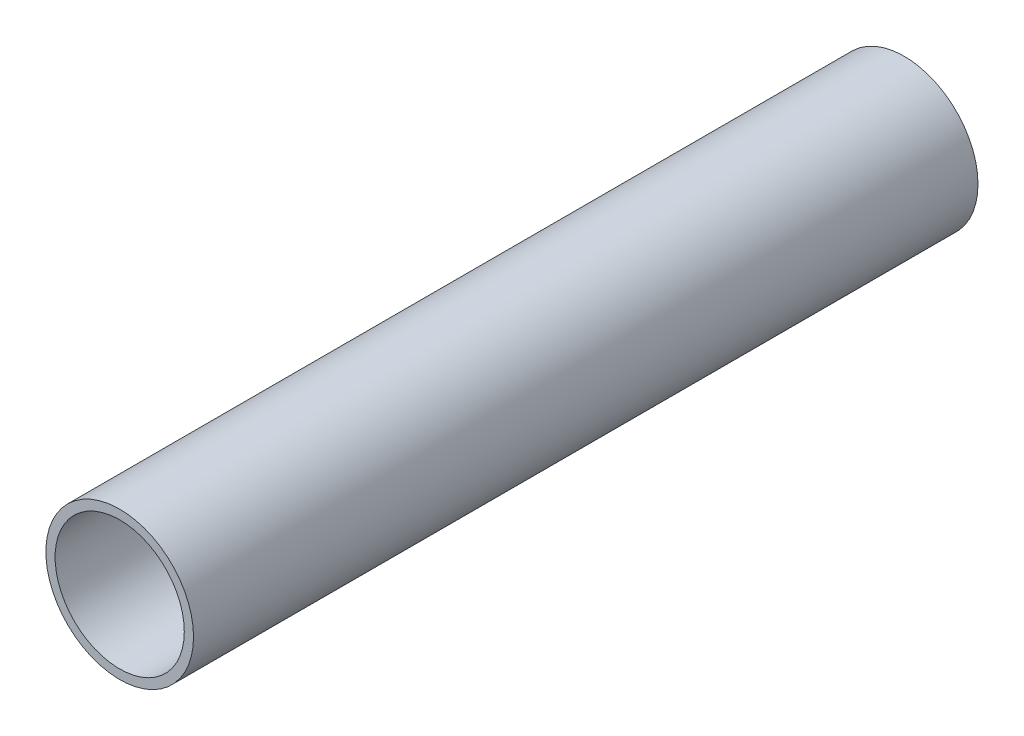
ISO-10303-21;
HEADER;
FILE_DESCRIPTION(('STEP AP214'),'2;1');
FILE_NAME('part.step','',(''),(''),'','','');
FILE_SCHEMA(('AUTOMOTIVE_DESIGN { 1 0 10303 214 1 1 1 1 }'));
ENDSEC;
DATA;
#1=APPLICATION_CONTEXT('core data for automotive mechanical design processes');
#2=APPLICATION_PROTOCOL_DEFINITION('international standard','automotive_design',2000,#1);
#3=PRODUCT_CONTEXT('',#1,'mechanical');
#4=PRODUCT('Part','Part','',(#3));
#5=PRODUCT_RELATED_PRODUCT_CATEGORY('part','',(#4));
#6=PRODUCT_DEFINITION_FORMATION('','',#4);
#7=PRODUCT_DEFINITION_CONTEXT('part definition',#1,'design');
#8=PRODUCT_DEFINITION('design','',#6,#7);
#9=PRODUCT_DEFINITION_SHAPE('','',#8);
#10=(LENGTH_UNIT() NAMED_UNIT(*) SI_UNIT(.MILLI.,.METRE.));
#11=(NAMED_UNIT(*) PLANE_ANGLE_UNIT() SI_UNIT($,.RADIAN.));
#12=(NAMED_UNIT(*) SI_UNIT($,.STERADIAN.) SOLID_ANGLE_UNIT());
#13=UNCERTAINTY_MEASURE_WITH_UNIT(LENGTH_MEASURE(1.E-05),#10,'distance_accuracy_value','');
#14=(GEOMETRIC_REPRESENTATION_CONTEXT(3) GLOBAL_UNCERTAINTY_ASSIGNED_CONTEXT((#13)) GLOBAL_UNIT_ASSIGNED_CONTEXT((#10,
#11,#12)) REPRESENTATION_CONTEXT('',''));
#15=CARTESIAN_POINT('',(0.,0.,0.));
#16=DIRECTION('',(0.,0.,1.));
#17=DIRECTION('',(1.,0.,0.));
#18=AXIS2_PLACEMENT_3D('',#15,#16,#17);
#19=CARTESIAN_POINT('',(0.,0.,85.));
#20=DIRECTION('',(0.,0.,1.));
#21=DIRECTION('',(1.,0.,0.));
#22=AXIS2_PLACEMENT_3D('',#19,#20,#21);
#23=PLANE('',#22);
#24=CARTESIAN_POINT('',(0.,0.,85.));
#25=DIRECTION('',(0.,0.,1.));
#26=DIRECTION('',(1.,0.,0.));
#27=AXIS2_PLACEMENT_3D('',#24,#25,#26);
#28=CIRCLE('',#27,8.);
#29=CARTESIAN_POINT('',(8.,0.,85.));
#30=VERTEX_POINT('',#29);
#31=EDGE_CURVE('E10',#30,#30,#28,.T.);
#32=ORIENTED_EDGE('',*,*,#31,.T.);
#33=EDGE_LOOP('',(#32));
#34=FACE_BOUND('',#33,.T.);
#35=CARTESIAN_POINT('',(0.,0.,85.));
#36=DIRECTION('',(0.,0.,1.));
#37=DIRECTION('',(1.,0.,0.));
#38=AXIS2_PLACEMENT_3D('',#35,#36,#37);
#39=CIRCLE('',#38,7.);
#40=CARTESIAN_POINT('',(7.,0.,85.));
#41=VERTEX_POINT('',#40);
#42=EDGE_CURVE('E60',#41,#41,#39,.T.);
#43=ORIENTED_EDGE('',*,*,#42,.F.);
#44=EDGE_LOOP('',(#43));
#45=FACE_BOUND('',#44,.T.);
#46=ADVANCED_FACE('F41',(#34,#45),#23,.T.);
#47=CARTESIAN_POINT('',(0.,0.,0.));
#48=DIRECTION('',(0.,0.,1.));
#49=DIRECTION('',(1.,0.,0.));
#50=AXIS2_PLACEMENT_3D('',#47,#48,#49);
#51=PLANE('',#50);
#52=CARTESIAN_POINT('',(0.,0.,0.));
#53=DIRECTION('',(0.,0.,1.));
#54=DIRECTION('',(1.,0.,0.));
#55=AXIS2_PLACEMENT_3D('',#52,#53,#54);
#56=CIRCLE('',#55,8.);
#57=CARTESIAN_POINT('',(8.,0.,0.));
#58=VERTEX_POINT('',#57);
#59=EDGE_CURVE('E44',#58,#58,#56,.T.);
#60=ORIENTED_EDGE('',*,*,#59,.F.);
#61=EDGE_LOOP('',(#60));
#62=FACE_BOUND('',#61,.T.);
#63=CARTESIAN_POINT('',(0.,0.,0.));
#64=DIRECTION('',(0.,0.,1.));
#65=DIRECTION('',(1.,0.,0.));
#66=AXIS2_PLACEMENT_3D('',#63,#64,#65);
#67=CIRCLE('',#66,7.);
#68=CARTESIAN_POINT('',(7.,0.,0.));
#69=VERTEX_POINT('',#68);
#70=EDGE_CURVE('E56',#69,#69,#67,.T.);
#71=ORIENTED_EDGE('',*,*,#70,.T.);
#72=EDGE_LOOP('',(#71));
#73=FACE_BOUND('',#72,.T.);
#74=ADVANCED_FACE('F71',(#62,#73),#51,.F.);
#75=CARTESIAN_POINT('',(0.,0.,85.));
#76=DIRECTION('',(0.,0.,-1.));
#77=DIRECTION('',(-1.,0.,0.));
#78=AXIS2_PLACEMENT_3D('',#75,#76,#77);
#79=CYLINDRICAL_SURFACE('',#78,8.);
#80=ORIENTED_EDGE('',*,*,#31,.F.);
#81=EDGE_LOOP('',(#80));
#82=FACE_BOUND('',#81,.T.);
#83=ORIENTED_EDGE('',*,*,#59,.T.);
#84=EDGE_LOOP('',(#83));
#85=FACE_BOUND('',#84,.T.);
#86=ADVANCED_FACE('F43',(#82,#85),#79,.T.);
#87=CARTESIAN_POINT('',(0.,0.,85.));
#88=DIRECTION('',(0.,0.,-1.));
#89=DIRECTION('',(-1.,0.,0.));
#90=AXIS2_PLACEMENT_3D('',#87,#88,#89);
#91=CYLINDRICAL_SURFACE('',#90,7.);
#92=ORIENTED_EDGE('',*,*,#42,.T.);
#93=EDGE_LOOP('',(#92));
#94=FACE_BOUND('',#93,.T.);
#95=ORIENTED_EDGE('',*,*,#70,.F.);
#96=EDGE_LOOP('',(#95));
#97=FACE_BOUND('',#96,.T.);
#98=ADVANCED_FACE('F69',(#94,#97),#91,.F.);
#99=CLOSED_SHELL('',(#46,#74,#86,#98));
#100=MANIFOLD_SOLID_BREP('B2',#99);
#101=ADVANCED_BREP_SHAPE_REPRESENTATION('',(#18,#100),#14);
#102=SHAPE_DEFINITION_REPRESENTATION(#9,#101);
ENDSEC;
END-ISO-10303-21;
